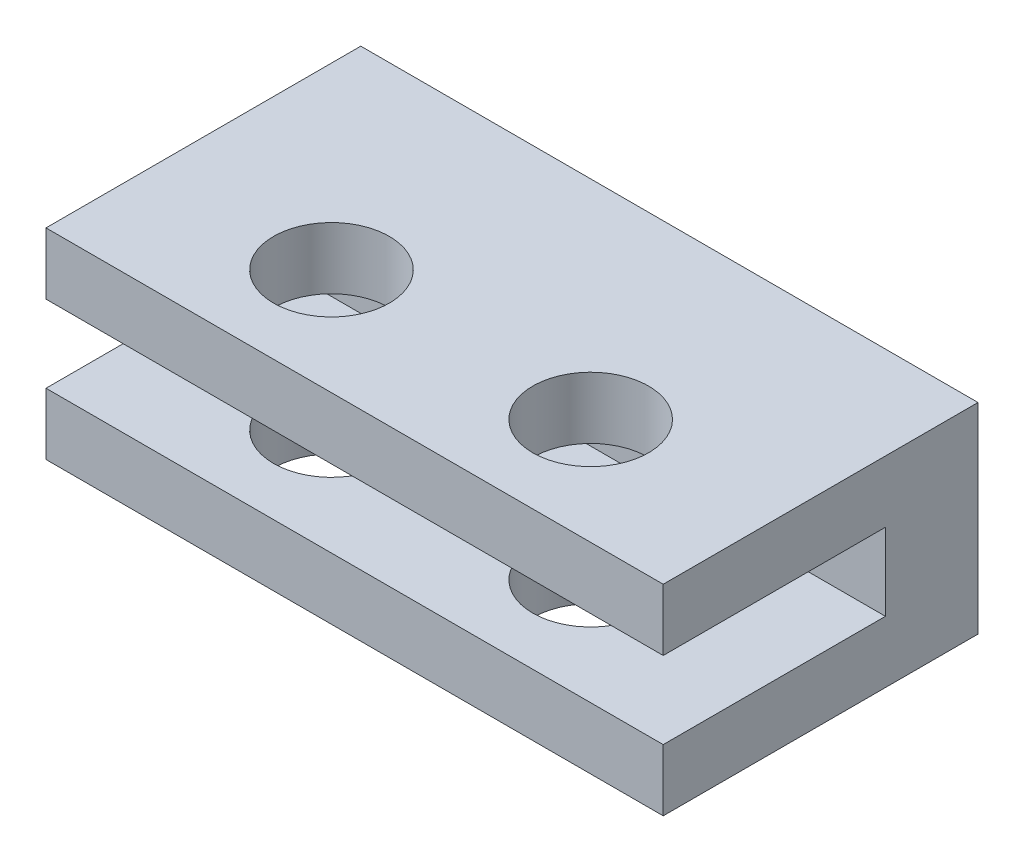
ISO-10303-21;
HEADER;
FILE_DESCRIPTION(('STEP AP214'),'2;1');
FILE_NAME('part.step','',(''),(''),'','','');
FILE_SCHEMA(('AUTOMOTIVE_DESIGN { 1 0 10303 214 1 1 1 1 }'));
ENDSEC;
DATA;
#1=APPLICATION_CONTEXT('core data for automotive mechanical design processes');
#2=APPLICATION_PROTOCOL_DEFINITION('international standard','automotive_design',2000,#1);
#3=PRODUCT_CONTEXT('',#1,'mechanical');
#4=PRODUCT('Part','Part','',(#3));
#5=PRODUCT_RELATED_PRODUCT_CATEGORY('part','',(#4));
#6=PRODUCT_DEFINITION_FORMATION('','',#4);
#7=PRODUCT_DEFINITION_CONTEXT('part definition',#1,'design');
#8=PRODUCT_DEFINITION('design','',#6,#7);
#9=PRODUCT_DEFINITION_SHAPE('','',#8);
#10=(LENGTH_UNIT() NAMED_UNIT(*) SI_UNIT(.MILLI.,.METRE.));
#11=(NAMED_UNIT(*) PLANE_ANGLE_UNIT() SI_UNIT($,.RADIAN.));
#12=(NAMED_UNIT(*) SI_UNIT($,.STERADIAN.) SOLID_ANGLE_UNIT());
#13=UNCERTAINTY_MEASURE_WITH_UNIT(LENGTH_MEASURE(1.E-05),#10,'distance_accuracy_value','');
#14=(GEOMETRIC_REPRESENTATION_CONTEXT(3) GLOBAL_UNCERTAINTY_ASSIGNED_CONTEXT((#13)) GLOBAL_UNIT_ASSIGNED_CONTEXT((#10,
#11,#12)) REPRESENTATION_CONTEXT('',''));
#15=CARTESIAN_POINT('',(0.,0.,0.));
#16=DIRECTION('',(0.,0.,1.));
#17=DIRECTION('',(1.,0.,0.));
#18=AXIS2_PLACEMENT_3D('',#15,#16,#17);
#19=CARTESIAN_POINT('',(-25.4,11.43,-5.33399999999999));
#20=DIRECTION('',(0.,0.,-1.));
#21=DIRECTION('',(-1.,0.,0.));
#22=AXIS2_PLACEMENT_3D('',#19,#20,#21);
#23=PLANE('',#22);
#24=DIRECTION('',(1.,0.,0.));
#25=VECTOR('',#24,1.);
#26=CARTESIAN_POINT('',(-25.4,11.43,-5.33399999999999));
#27=LINE('',#26,#25);
#28=CARTESIAN_POINT('',(-25.4,11.43,-5.33399999999999));
#29=VERTEX_POINT('',#28);
#30=CARTESIAN_POINT('',(25.4,11.43,-5.33399999999999));
#31=VERTEX_POINT('',#30);
#32=EDGE_CURVE('E140',#29,#31,#27,.T.);
#33=ORIENTED_EDGE('',*,*,#32,.F.);
#34=DIRECTION('',(0.,-1.,0.));
#35=VECTOR('',#34,1.);
#36=CARTESIAN_POINT('',(-25.4,11.43,-5.33399999999999));
#37=LINE('',#36,#35);
#38=CARTESIAN_POINT('',(-25.4,5.08,-5.334));
#39=VERTEX_POINT('',#38);
#40=EDGE_CURVE('E49',#29,#39,#37,.T.);
#41=ORIENTED_EDGE('',*,*,#40,.T.);
#42=DIRECTION('',(1.,0.,0.));
#43=VECTOR('',#42,1.);
#44=CARTESIAN_POINT('',(-25.4,5.08,-5.33399999999999));
#45=LINE('',#44,#43);
#46=CARTESIAN_POINT('',(25.4,5.08,-5.33399999999999));
#47=VERTEX_POINT('',#46);
#48=EDGE_CURVE('E167',#39,#47,#45,.T.);
#49=ORIENTED_EDGE('',*,*,#48,.T.);
#50=DIRECTION('',(0.,-1.,0.));
#51=VECTOR('',#50,1.);
#52=CARTESIAN_POINT('',(25.4,11.43,-5.33399999999999));
#53=LINE('',#52,#51);
#54=EDGE_CURVE('E107',#31,#47,#53,.T.);
#55=ORIENTED_EDGE('',*,*,#54,.F.);
#56=EDGE_LOOP('',(#33,#41,#49,#55));
#57=FACE_BOUND('',#56,.T.);
#58=ADVANCED_FACE('F32',(#57),#23,.F.);
#59=CARTESIAN_POINT('',(-25.4,5.08,12.954));
#60=DIRECTION('',(1.,0.,0.));
#61=DIRECTION('',(0.,0.,-1.));
#62=AXIS2_PLACEMENT_3D('',#59,#60,#61);
#63=PLANE('',#62);
#64=DIRECTION('',(0.,0.,1.));
#65=VECTOR('',#64,1.);
#66=CARTESIAN_POINT('',(-25.4,0.,12.954));
#67=LINE('',#66,#65);
#68=CARTESIAN_POINT('',(-25.4,0.,-12.954));
#69=VERTEX_POINT('',#68);
#70=CARTESIAN_POINT('',(-25.4,0.,12.954));
#71=VERTEX_POINT('',#70);
#72=EDGE_CURVE('E97',#69,#71,#67,.T.);
#73=ORIENTED_EDGE('',*,*,#72,.T.);
#74=DIRECTION('',(0.,-1.,0.));
#75=VECTOR('',#74,1.);
#76=CARTESIAN_POINT('',(-25.4,5.08,12.954));
#77=LINE('',#76,#75);
#78=CARTESIAN_POINT('',(-25.4,5.08,12.954));
#79=VERTEX_POINT('',#78);
#80=EDGE_CURVE('E11',#79,#71,#77,.T.);
#81=ORIENTED_EDGE('',*,*,#80,.F.);
#82=DIRECTION('',(0.,0.,1.));
#83=VECTOR('',#82,1.);
#84=CARTESIAN_POINT('',(-25.4,5.08,12.954));
#85=LINE('',#84,#83);
#86=EDGE_CURVE('E90',#39,#79,#85,.T.);
#87=ORIENTED_EDGE('',*,*,#86,.F.);
#88=ORIENTED_EDGE('',*,*,#40,.F.);
#89=DIRECTION('',(0.,0.,-1.));
#90=VECTOR('',#89,1.);
#91=CARTESIAN_POINT('',(-25.4,11.43,12.954));
#92=LINE('',#91,#90);
#93=CARTESIAN_POINT('',(-25.4,11.43,12.954));
#94=VERTEX_POINT('',#93);
#95=EDGE_CURVE('E158',#94,#29,#92,.T.);
#96=ORIENTED_EDGE('',*,*,#95,.F.);
#97=DIRECTION('',(0.,-1.,0.));
#98=VECTOR('',#97,1.);
#99=CARTESIAN_POINT('',(-25.4,16.51,12.954));
#100=LINE('',#99,#98);
#101=CARTESIAN_POINT('',(-25.4,16.51,12.954));
#102=VERTEX_POINT('',#101);
#103=EDGE_CURVE('E141',#102,#94,#100,.T.);
#104=ORIENTED_EDGE('',*,*,#103,.F.);
#105=DIRECTION('',(0.,0.,1.));
#106=VECTOR('',#105,1.);
#107=CARTESIAN_POINT('',(-25.4,16.51,-12.954));
#108=LINE('',#107,#106);
#109=CARTESIAN_POINT('',(-25.4,16.51,-12.954));
#110=VERTEX_POINT('',#109);
#111=EDGE_CURVE('E100',#110,#102,#108,.T.);
#112=ORIENTED_EDGE('',*,*,#111,.F.);
#113=DIRECTION('',(0.,-1.,0.));
#114=VECTOR('',#113,1.);
#115=CARTESIAN_POINT('',(-25.4,5.08,-12.954));
#116=LINE('',#115,#114);
#117=EDGE_CURVE('E83',#110,#69,#116,.T.);
#118=ORIENTED_EDGE('',*,*,#117,.T.);
#119=EDGE_LOOP('',(#73,#81,#87,#88,#96,#104,#112,#118));
#120=FACE_BOUND('',#119,.T.);
#121=ADVANCED_FACE('F34',(#120),#63,.F.);
#122=CARTESIAN_POINT('',(25.4,5.08,12.954));
#123=DIRECTION('',(0.,0.,-1.));
#124=DIRECTION('',(-1.,0.,0.));
#125=AXIS2_PLACEMENT_3D('',#122,#123,#124);
#126=PLANE('',#125);
#127=DIRECTION('',(1.,0.,0.));
#128=VECTOR('',#127,1.);
#129=CARTESIAN_POINT('',(25.4,0.,12.954));
#130=LINE('',#129,#128);
#131=CARTESIAN_POINT('',(25.4,0.,12.954));
#132=VERTEX_POINT('',#131);
#133=EDGE_CURVE('E104',#71,#132,#130,.T.);
#134=ORIENTED_EDGE('',*,*,#133,.T.);
#135=DIRECTION('',(0.,-1.,0.));
#136=VECTOR('',#135,1.);
#137=CARTESIAN_POINT('',(25.4,5.08,12.954));
#138=LINE('',#137,#136);
#139=CARTESIAN_POINT('',(25.4,5.08,12.954));
#140=VERTEX_POINT('',#139);
#141=EDGE_CURVE('E41',#140,#132,#138,.T.);
#142=ORIENTED_EDGE('',*,*,#141,.F.);
#143=DIRECTION('',(1.,0.,0.));
#144=VECTOR('',#143,1.);
#145=CARTESIAN_POINT('',(25.4,5.08,12.954));
#146=LINE('',#145,#144);
#147=EDGE_CURVE('E58',#79,#140,#146,.T.);
#148=ORIENTED_EDGE('',*,*,#147,.F.);
#149=ORIENTED_EDGE('',*,*,#80,.T.);
#150=EDGE_LOOP('',(#134,#142,#148,#149));
#151=FACE_BOUND('',#150,.T.);
#152=ADVANCED_FACE('F205',(#151),#126,.F.);
#153=CARTESIAN_POINT('',(25.4,5.08,12.954));
#154=DIRECTION('',(-1.,0.,0.));
#155=DIRECTION('',(0.,0.,1.));
#156=AXIS2_PLACEMENT_3D('',#153,#154,#155);
#157=PLANE('',#156);
#158=DIRECTION('',(0.,0.,-1.));
#159=VECTOR('',#158,1.);
#160=CARTESIAN_POINT('',(25.4,0.,12.954));
#161=LINE('',#160,#159);
#162=CARTESIAN_POINT('',(25.4,0.,-12.954));
#163=VERTEX_POINT('',#162);
#164=EDGE_CURVE('E91',#132,#163,#161,.T.);
#165=ORIENTED_EDGE('',*,*,#164,.T.);
#166=DIRECTION('',(0.,-1.,0.));
#167=VECTOR('',#166,1.);
#168=CARTESIAN_POINT('',(25.4,5.08,-12.954));
#169=LINE('',#168,#167);
#170=CARTESIAN_POINT('',(25.4,16.51,-12.954));
#171=VERTEX_POINT('',#170);
#172=EDGE_CURVE('E86',#171,#163,#169,.T.);
#173=ORIENTED_EDGE('',*,*,#172,.F.);
#174=DIRECTION('',(0.,0.,-1.));
#175=VECTOR('',#174,1.);
#176=CARTESIAN_POINT('',(25.4,16.51,-12.954));
#177=LINE('',#176,#175);
#178=CARTESIAN_POINT('',(25.4,16.51,12.954));
#179=VERTEX_POINT('',#178);
#180=EDGE_CURVE('E162',#179,#171,#177,.T.);
#181=ORIENTED_EDGE('',*,*,#180,.F.);
#182=DIRECTION('',(0.,1.,0.));
#183=VECTOR('',#182,1.);
#184=CARTESIAN_POINT('',(25.4,16.51,12.954));
#185=LINE('',#184,#183);
#186=CARTESIAN_POINT('',(25.4,11.43,12.954));
#187=VERTEX_POINT('',#186);
#188=EDGE_CURVE('E147',#187,#179,#185,.T.);
#189=ORIENTED_EDGE('',*,*,#188,.F.);
#190=DIRECTION('',(0.,0.,-1.));
#191=VECTOR('',#190,1.);
#192=CARTESIAN_POINT('',(25.4,11.43,12.954));
#193=LINE('',#192,#191);
#194=EDGE_CURVE('E153',#187,#31,#193,.T.);
#195=ORIENTED_EDGE('',*,*,#194,.T.);
#196=ORIENTED_EDGE('',*,*,#54,.T.);
#197=DIRECTION('',(0.,0.,-1.));
#198=VECTOR('',#197,1.);
#199=CARTESIAN_POINT('',(25.4,5.08,12.954));
#200=LINE('',#199,#198);
#201=EDGE_CURVE('E101',#140,#47,#200,.T.);
#202=ORIENTED_EDGE('',*,*,#201,.F.);
#203=ORIENTED_EDGE('',*,*,#141,.T.);
#204=EDGE_LOOP('',(#165,#173,#181,#189,#195,#196,#202,#203));
#205=FACE_BOUND('',#204,.T.);
#206=ADVANCED_FACE('F180',(#205),#157,.F.);
#207=CARTESIAN_POINT('',(25.4,5.08,-12.954));
#208=DIRECTION('',(0.,0.,1.));
#209=DIRECTION('',(1.,0.,0.));
#210=AXIS2_PLACEMENT_3D('',#207,#208,#209);
#211=PLANE('',#210);
#212=DIRECTION('',(-1.,0.,0.));
#213=VECTOR('',#212,1.);
#214=CARTESIAN_POINT('',(25.4,0.,-12.954));
#215=LINE('',#214,#213);
#216=EDGE_CURVE('E78',#163,#69,#215,.T.);
#217=ORIENTED_EDGE('',*,*,#216,.T.);
#218=ORIENTED_EDGE('',*,*,#117,.F.);
#219=DIRECTION('',(-1.,0.,0.));
#220=VECTOR('',#219,1.);
#221=CARTESIAN_POINT('',(-25.4,16.51,-12.954));
#222=LINE('',#221,#220);
#223=EDGE_CURVE('E165',#171,#110,#222,.T.);
#224=ORIENTED_EDGE('',*,*,#223,.F.);
#225=ORIENTED_EDGE('',*,*,#172,.T.);
#226=EDGE_LOOP('',(#217,#218,#224,#225));
#227=FACE_BOUND('',#226,.T.);
#228=ADVANCED_FACE('F80',(#227),#211,.F.);
#229=CARTESIAN_POINT('',(0.,5.08,0.));
#230=DIRECTION('',(0.,1.,0.));
#231=DIRECTION('',(0.,0.,1.));
#232=AXIS2_PLACEMENT_3D('',#229,#230,#231);
#233=PLANE('',#232);
#234=CARTESIAN_POINT('',(-10.668,5.08,4.19100000000001));
#235=DIRECTION('',(0.,1.,0.));
#236=DIRECTION('',(0.,0.,1.));
#237=AXIS2_PLACEMENT_3D('',#234,#235,#236);
#238=CIRCLE('',#237,4.7625);
#239=CARTESIAN_POINT('',(-10.668,5.08,8.95350000000001));
#240=VERTEX_POINT('',#239);
#241=EDGE_CURVE('E137',#240,#240,#238,.T.);
#242=ORIENTED_EDGE('',*,*,#241,.F.);
#243=EDGE_LOOP('',(#242));
#244=FACE_BOUND('',#243,.T.);
#245=CARTESIAN_POINT('',(10.668,5.08,4.19100000000001));
#246=DIRECTION('',(0.,1.,0.));
#247=DIRECTION('',(0.,0.,1.));
#248=AXIS2_PLACEMENT_3D('',#245,#246,#247);
#249=CIRCLE('',#248,4.7625);
#250=CARTESIAN_POINT('',(10.668,5.08,8.95350000000001));
#251=VERTEX_POINT('',#250);
#252=EDGE_CURVE('E117',#251,#251,#249,.T.);
#253=ORIENTED_EDGE('',*,*,#252,.F.);
#254=EDGE_LOOP('',(#253));
#255=FACE_BOUND('',#254,.T.);
#256=ORIENTED_EDGE('',*,*,#48,.F.);
#257=ORIENTED_EDGE('',*,*,#86,.T.);
#258=ORIENTED_EDGE('',*,*,#147,.T.);
#259=ORIENTED_EDGE('',*,*,#201,.T.);
#260=EDGE_LOOP('',(#256,#257,#258,#259));
#261=FACE_BOUND('',#260,.T.);
#262=ADVANCED_FACE('F172',(#244,#255,#261),#233,.T.);
#263=CARTESIAN_POINT('',(0.,0.,0.));
#264=DIRECTION('',(0.,1.,0.));
#265=DIRECTION('',(0.,0.,1.));
#266=AXIS2_PLACEMENT_3D('',#263,#264,#265);
#267=PLANE('',#266);
#268=CARTESIAN_POINT('',(-10.668,0.,4.19100000000001));
#269=DIRECTION('',(0.,1.,0.));
#270=DIRECTION('',(0.,0.,1.));
#271=AXIS2_PLACEMENT_3D('',#268,#269,#270);
#272=CIRCLE('',#271,4.7625);
#273=CARTESIAN_POINT('',(-10.668,0.,8.95350000000001));
#274=VERTEX_POINT('',#273);
#275=EDGE_CURVE('E118',#274,#274,#272,.T.);
#276=ORIENTED_EDGE('',*,*,#275,.T.);
#277=EDGE_LOOP('',(#276));
#278=FACE_BOUND('',#277,.T.);
#279=CARTESIAN_POINT('',(10.668,0.,4.19100000000001));
#280=DIRECTION('',(0.,1.,0.));
#281=DIRECTION('',(0.,0.,1.));
#282=AXIS2_PLACEMENT_3D('',#279,#280,#281);
#283=CIRCLE('',#282,4.7625);
#284=CARTESIAN_POINT('',(10.668,0.,8.95350000000001));
#285=VERTEX_POINT('',#284);
#286=EDGE_CURVE('E129',#285,#285,#283,.T.);
#287=ORIENTED_EDGE('',*,*,#286,.T.);
#288=EDGE_LOOP('',(#287));
#289=FACE_BOUND('',#288,.T.);
#290=ORIENTED_EDGE('',*,*,#72,.F.);
#291=ORIENTED_EDGE('',*,*,#216,.F.);
#292=ORIENTED_EDGE('',*,*,#164,.F.);
#293=ORIENTED_EDGE('',*,*,#133,.F.);
#294=EDGE_LOOP('',(#290,#291,#292,#293));
#295=FACE_BOUND('',#294,.T.);
#296=ADVANCED_FACE('F103',(#278,#289,#295),#267,.F.);
#297=CARTESIAN_POINT('',(0.,16.51,0.));
#298=DIRECTION('',(0.,1.,0.));
#299=DIRECTION('',(0.,0.,1.));
#300=AXIS2_PLACEMENT_3D('',#297,#298,#299);
#301=PLANE('',#300);
#302=CARTESIAN_POINT('',(-10.668,16.51,4.19100000000001));
#303=DIRECTION('',(0.,1.,0.));
#304=DIRECTION('',(0.,0.,1.));
#305=AXIS2_PLACEMENT_3D('',#302,#303,#304);
#306=CIRCLE('',#305,4.7625);
#307=CARTESIAN_POINT('',(-10.668,16.51,8.95350000000001));
#308=VERTEX_POINT('',#307);
#309=EDGE_CURVE('E124',#308,#308,#306,.T.);
#310=ORIENTED_EDGE('',*,*,#309,.F.);
#311=EDGE_LOOP('',(#310));
#312=FACE_BOUND('',#311,.T.);
#313=CARTESIAN_POINT('',(10.668,16.51,4.19100000000001));
#314=DIRECTION('',(0.,1.,0.));
#315=DIRECTION('',(0.,0.,1.));
#316=AXIS2_PLACEMENT_3D('',#313,#314,#315);
#317=CIRCLE('',#316,4.7625);
#318=CARTESIAN_POINT('',(10.668,16.51,8.95350000000001));
#319=VERTEX_POINT('',#318);
#320=EDGE_CURVE('E134',#319,#319,#317,.T.);
#321=ORIENTED_EDGE('',*,*,#320,.F.);
#322=EDGE_LOOP('',(#321));
#323=FACE_BOUND('',#322,.T.);
#324=ORIENTED_EDGE('',*,*,#111,.T.);
#325=DIRECTION('',(-1.,0.,0.));
#326=VECTOR('',#325,1.);
#327=CARTESIAN_POINT('',(-25.4,16.51,12.954));
#328=LINE('',#327,#326);
#329=EDGE_CURVE('E150',#179,#102,#328,.T.);
#330=ORIENTED_EDGE('',*,*,#329,.F.);
#331=ORIENTED_EDGE('',*,*,#180,.T.);
#332=ORIENTED_EDGE('',*,*,#223,.T.);
#333=EDGE_LOOP('',(#324,#330,#331,#332));
#334=FACE_BOUND('',#333,.T.);
#335=ADVANCED_FACE('F201',(#312,#323,#334),#301,.T.);
#336=CARTESIAN_POINT('',(-25.4,11.43,12.954));
#337=DIRECTION('',(0.,1.,0.));
#338=DIRECTION('',(0.,0.,1.));
#339=AXIS2_PLACEMENT_3D('',#336,#337,#338);
#340=PLANE('',#339);
#341=CARTESIAN_POINT('',(-10.668,11.43,4.19100000000001));
#342=DIRECTION('',(0.,1.,0.));
#343=DIRECTION('',(0.,0.,1.));
#344=AXIS2_PLACEMENT_3D('',#341,#342,#343);
#345=CIRCLE('',#344,4.7625);
#346=CARTESIAN_POINT('',(-10.668,11.43,8.95350000000001));
#347=VERTEX_POINT('',#346);
#348=EDGE_CURVE('E36',#347,#347,#345,.T.);
#349=ORIENTED_EDGE('',*,*,#348,.T.);
#350=EDGE_LOOP('',(#349));
#351=FACE_BOUND('',#350,.T.);
#352=CARTESIAN_POINT('',(10.668,11.43,4.19100000000001));
#353=DIRECTION('',(0.,1.,0.));
#354=DIRECTION('',(0.,0.,1.));
#355=AXIS2_PLACEMENT_3D('',#352,#353,#354);
#356=CIRCLE('',#355,4.7625);
#357=CARTESIAN_POINT('',(10.668,11.43,8.95350000000001));
#358=VERTEX_POINT('',#357);
#359=EDGE_CURVE('E115',#358,#358,#356,.T.);
#360=ORIENTED_EDGE('',*,*,#359,.T.);
#361=EDGE_LOOP('',(#360));
#362=FACE_BOUND('',#361,.T.);
#363=ORIENTED_EDGE('',*,*,#32,.T.);
#364=ORIENTED_EDGE('',*,*,#194,.F.);
#365=DIRECTION('',(1.,0.,0.));
#366=VECTOR('',#365,1.);
#367=CARTESIAN_POINT('',(-25.4,11.43,12.954));
#368=LINE('',#367,#366);
#369=EDGE_CURVE('E144',#94,#187,#368,.T.);
#370=ORIENTED_EDGE('',*,*,#369,.F.);
#371=ORIENTED_EDGE('',*,*,#95,.T.);
#372=EDGE_LOOP('',(#363,#364,#370,#371));
#373=FACE_BOUND('',#372,.T.);
#374=ADVANCED_FACE('F187',(#351,#362,#373),#340,.F.);
#375=CARTESIAN_POINT('',(0.,0.,12.954));
#376=DIRECTION('',(0.,0.,1.));
#377=DIRECTION('',(1.,0.,0.));
#378=AXIS2_PLACEMENT_3D('',#375,#376,#377);
#379=PLANE('',#378);
#380=ORIENTED_EDGE('',*,*,#103,.T.);
#381=ORIENTED_EDGE('',*,*,#369,.T.);
#382=ORIENTED_EDGE('',*,*,#188,.T.);
#383=ORIENTED_EDGE('',*,*,#329,.T.);
#384=EDGE_LOOP('',(#380,#381,#382,#383));
#385=FACE_BOUND('',#384,.T.);
#386=ADVANCED_FACE('F202',(#385),#379,.T.);
#387=CARTESIAN_POINT('',(10.668,0.,4.19100000000001));
#388=DIRECTION('',(0.,1.,0.));
#389=DIRECTION('',(0.,0.,1.));
#390=AXIS2_PLACEMENT_3D('',#387,#388,#389);
#391=CYLINDRICAL_SURFACE('',#390,4.7625);
#392=ORIENTED_EDGE('',*,*,#320,.T.);
#393=EDGE_LOOP('',(#392));
#394=FACE_BOUND('',#393,.T.);
#395=ORIENTED_EDGE('',*,*,#359,.F.);
#396=EDGE_LOOP('',(#395));
#397=FACE_BOUND('',#396,.T.);
#398=ADVANCED_FACE('F256',(#394,#397),#391,.F.);
#399=CARTESIAN_POINT('',(-10.668,0.,4.19100000000001));
#400=DIRECTION('',(0.,1.,0.));
#401=DIRECTION('',(0.,0.,1.));
#402=AXIS2_PLACEMENT_3D('',#399,#400,#401);
#403=CYLINDRICAL_SURFACE('',#402,4.7625);
#404=ORIENTED_EDGE('',*,*,#309,.T.);
#405=EDGE_LOOP('',(#404));
#406=FACE_BOUND('',#405,.T.);
#407=ORIENTED_EDGE('',*,*,#348,.F.);
#408=EDGE_LOOP('',(#407));
#409=FACE_BOUND('',#408,.T.);
#410=ADVANCED_FACE('F262',(#406,#409),#403,.F.);
#411=ORIENTED_EDGE('',*,*,#252,.T.);
#412=EDGE_LOOP('',(#411));
#413=FACE_BOUND('',#412,.T.);
#414=ORIENTED_EDGE('',*,*,#286,.F.);
#415=EDGE_LOOP('',(#414));
#416=FACE_BOUND('',#415,.T.);
#417=ADVANCED_FACE('F265',(#413,#416),#391,.F.);
#418=ORIENTED_EDGE('',*,*,#241,.T.);
#419=EDGE_LOOP('',(#418));
#420=FACE_BOUND('',#419,.T.);
#421=ORIENTED_EDGE('',*,*,#275,.F.);
#422=EDGE_LOOP('',(#421));
#423=FACE_BOUND('',#422,.T.);
#424=ADVANCED_FACE('F273',(#420,#423),#403,.F.);
#425=CLOSED_SHELL('',(#58,#121,#152,#206,#228,#262,#296,#335,#374,#386,#398,#410,#417,#424));
#426=MANIFOLD_SOLID_BREP('B2',#425);
#427=ADVANCED_BREP_SHAPE_REPRESENTATION('',(#18,#426),#14);
#428=SHAPE_DEFINITION_REPRESENTATION(#9,#427);
ENDSEC;
END-ISO-10303-21;
